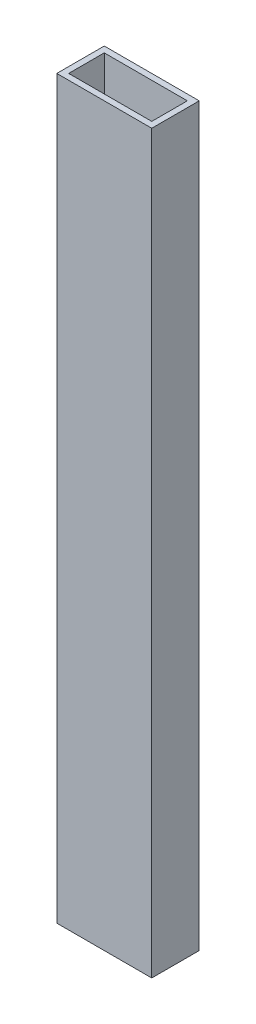
ISO-10303-21;
HEADER;
FILE_DESCRIPTION(('STEP AP214'),'2;1');
FILE_NAME('part.step','',(''),(''),'','','');
FILE_SCHEMA(('AUTOMOTIVE_DESIGN { 1 0 10303 214 1 1 1 1 }'));
ENDSEC;
DATA;
#1=APPLICATION_CONTEXT('core data for automotive mechanical design processes');
#2=APPLICATION_PROTOCOL_DEFINITION('international standard','automotive_design',2000,#1);
#3=PRODUCT_CONTEXT('',#1,'mechanical');
#4=PRODUCT('Part','Part','',(#3));
#5=PRODUCT_RELATED_PRODUCT_CATEGORY('part','',(#4));
#6=PRODUCT_DEFINITION_FORMATION('','',#4);
#7=PRODUCT_DEFINITION_CONTEXT('part definition',#1,'design');
#8=PRODUCT_DEFINITION('design','',#6,#7);
#9=PRODUCT_DEFINITION_SHAPE('','',#8);
#10=(LENGTH_UNIT() NAMED_UNIT(*) SI_UNIT(.MILLI.,.METRE.));
#11=(NAMED_UNIT(*) PLANE_ANGLE_UNIT() SI_UNIT($,.RADIAN.));
#12=(NAMED_UNIT(*) SI_UNIT($,.STERADIAN.) SOLID_ANGLE_UNIT());
#13=UNCERTAINTY_MEASURE_WITH_UNIT(LENGTH_MEASURE(1.E-05),#10,'distance_accuracy_value','');
#14=(GEOMETRIC_REPRESENTATION_CONTEXT(3) GLOBAL_UNCERTAINTY_ASSIGNED_CONTEXT((#13)) GLOBAL_UNIT_ASSIGNED_CONTEXT((#10,
#11,#12)) REPRESENTATION_CONTEXT('',''));
#15=CARTESIAN_POINT('',(0.,0.,0.));
#16=DIRECTION('',(0.,0.,1.));
#17=DIRECTION('',(1.,0.,0.));
#18=AXIS2_PLACEMENT_3D('',#15,#16,#17);
#19=CARTESIAN_POINT('',(0.,196.85,0.));
#20=DIRECTION('',(0.,1.,0.));
#21=DIRECTION('',(0.,0.,1.));
#22=AXIS2_PLACEMENT_3D('',#19,#20,#21);
#23=PLANE('',#22);
#24=DIRECTION('',(0.,0.,-1.));
#25=VECTOR('',#24,1.);
#26=CARTESIAN_POINT('',(25.4,196.85,-12.7));
#27=LINE('',#26,#25);
#28=CARTESIAN_POINT('',(25.4,196.85,12.7));
#29=VERTEX_POINT('',#28);
#30=CARTESIAN_POINT('',(25.4,196.85,-12.7));
#31=VERTEX_POINT('',#30);
#32=EDGE_CURVE('E135',#29,#31,#27,.T.);
#33=ORIENTED_EDGE('',*,*,#32,.T.);
#34=DIRECTION('',(-1.,0.,0.));
#35=VECTOR('',#34,1.);
#36=CARTESIAN_POINT('',(-25.4,196.85,-12.7));
#37=LINE('',#36,#35);
#38=CARTESIAN_POINT('',(-25.4,196.85,-12.7));
#39=VERTEX_POINT('',#38);
#40=EDGE_CURVE('E138',#31,#39,#37,.T.);
#41=ORIENTED_EDGE('',*,*,#40,.T.);
#42=DIRECTION('',(0.,0.,1.));
#43=VECTOR('',#42,1.);
#44=CARTESIAN_POINT('',(-25.4,196.85,-12.7));
#45=LINE('',#44,#43);
#46=CARTESIAN_POINT('',(-25.4,196.85,12.7));
#47=VERTEX_POINT('',#46);
#48=EDGE_CURVE('E141',#39,#47,#45,.T.);
#49=ORIENTED_EDGE('',*,*,#48,.T.);
#50=DIRECTION('',(1.,0.,0.));
#51=VECTOR('',#50,1.);
#52=CARTESIAN_POINT('',(-25.4,196.85,12.7));
#53=LINE('',#52,#51);
#54=EDGE_CURVE('E143',#47,#29,#53,.T.);
#55=ORIENTED_EDGE('',*,*,#54,.T.);
#56=EDGE_LOOP('',(#33,#41,#49,#55));
#57=FACE_BOUND('',#56,.T.);
#58=DIRECTION('',(-1.,0.,0.));
#59=VECTOR('',#58,1.);
#60=CARTESIAN_POINT('',(-22.225,196.85,-9.525));
#61=LINE('',#60,#59);
#62=CARTESIAN_POINT('',(22.225,196.85,-9.525));
#63=VERTEX_POINT('',#62);
#64=CARTESIAN_POINT('',(-22.225,196.85,-9.525));
#65=VERTEX_POINT('',#64);
#66=EDGE_CURVE('E107',#63,#65,#61,.T.);
#67=ORIENTED_EDGE('',*,*,#66,.F.);
#68=DIRECTION('',(0.,0.,-1.));
#69=VECTOR('',#68,1.);
#70=CARTESIAN_POINT('',(22.225,196.85,-9.525));
#71=LINE('',#70,#69);
#72=CARTESIAN_POINT('',(22.225,196.85,9.525));
#73=VERTEX_POINT('',#72);
#74=EDGE_CURVE('E99',#73,#63,#71,.T.);
#75=ORIENTED_EDGE('',*,*,#74,.F.);
#76=DIRECTION('',(1.,0.,0.));
#77=VECTOR('',#76,1.);
#78=CARTESIAN_POINT('',(-22.225,196.85,9.525));
#79=LINE('',#78,#77);
#80=CARTESIAN_POINT('',(-22.225,196.85,9.525));
#81=VERTEX_POINT('',#80);
#82=EDGE_CURVE('E121',#81,#73,#79,.T.);
#83=ORIENTED_EDGE('',*,*,#82,.F.);
#84=DIRECTION('',(0.,0.,1.));
#85=VECTOR('',#84,1.);
#86=CARTESIAN_POINT('',(-22.225,196.85,-9.525));
#87=LINE('',#86,#85);
#88=EDGE_CURVE('E119',#65,#81,#87,.T.);
#89=ORIENTED_EDGE('',*,*,#88,.F.);
#90=EDGE_LOOP('',(#67,#75,#83,#89));
#91=FACE_BOUND('',#90,.T.);
#92=ADVANCED_FACE('F34',(#57,#91),#23,.T.);
#93=CARTESIAN_POINT('',(0.,-196.85,0.));
#94=DIRECTION('',(0.,1.,0.));
#95=DIRECTION('',(0.,0.,1.));
#96=AXIS2_PLACEMENT_3D('',#93,#94,#95);
#97=PLANE('',#96);
#98=DIRECTION('',(0.,0.,-1.));
#99=VECTOR('',#98,1.);
#100=CARTESIAN_POINT('',(25.4,-196.85,-12.7));
#101=LINE('',#100,#99);
#102=CARTESIAN_POINT('',(25.4,-196.85,12.7));
#103=VERTEX_POINT('',#102);
#104=CARTESIAN_POINT('',(25.4,-196.85,-12.7));
#105=VERTEX_POINT('',#104);
#106=EDGE_CURVE('E115',#103,#105,#101,.T.);
#107=ORIENTED_EDGE('',*,*,#106,.F.);
#108=DIRECTION('',(1.,0.,0.));
#109=VECTOR('',#108,1.);
#110=CARTESIAN_POINT('',(-25.4,-196.85,12.7));
#111=LINE('',#110,#109);
#112=CARTESIAN_POINT('',(-25.4,-196.85,12.7));
#113=VERTEX_POINT('',#112);
#114=EDGE_CURVE('E139',#113,#103,#111,.T.);
#115=ORIENTED_EDGE('',*,*,#114,.F.);
#116=DIRECTION('',(0.,0.,1.));
#117=VECTOR('',#116,1.);
#118=CARTESIAN_POINT('',(-25.4,-196.85,-12.7));
#119=LINE('',#118,#117);
#120=CARTESIAN_POINT('',(-25.4,-196.85,-12.7));
#121=VERTEX_POINT('',#120);
#122=EDGE_CURVE('E150',#121,#113,#119,.T.);
#123=ORIENTED_EDGE('',*,*,#122,.F.);
#124=DIRECTION('',(-1.,0.,0.));
#125=VECTOR('',#124,1.);
#126=CARTESIAN_POINT('',(-25.4,-196.85,-12.7));
#127=LINE('',#126,#125);
#128=EDGE_CURVE('E148',#105,#121,#127,.T.);
#129=ORIENTED_EDGE('',*,*,#128,.F.);
#130=EDGE_LOOP('',(#107,#115,#123,#129));
#131=FACE_BOUND('',#130,.T.);
#132=DIRECTION('',(0.,0.,-1.));
#133=VECTOR('',#132,1.);
#134=CARTESIAN_POINT('',(22.225,-196.85,-9.525));
#135=LINE('',#134,#133);
#136=CARTESIAN_POINT('',(22.225,-196.85,9.525));
#137=VERTEX_POINT('',#136);
#138=CARTESIAN_POINT('',(22.225,-196.85,-9.525));
#139=VERTEX_POINT('',#138);
#140=EDGE_CURVE('E57',#137,#139,#135,.T.);
#141=ORIENTED_EDGE('',*,*,#140,.T.);
#142=DIRECTION('',(-1.,0.,0.));
#143=VECTOR('',#142,1.);
#144=CARTESIAN_POINT('',(-22.225,-196.85,-9.525));
#145=LINE('',#144,#143);
#146=CARTESIAN_POINT('',(-22.225,-196.85,-9.525));
#147=VERTEX_POINT('',#146);
#148=EDGE_CURVE('E114',#139,#147,#145,.T.);
#149=ORIENTED_EDGE('',*,*,#148,.T.);
#150=DIRECTION('',(0.,0.,1.));
#151=VECTOR('',#150,1.);
#152=CARTESIAN_POINT('',(-22.225,-196.85,-9.525));
#153=LINE('',#152,#151);
#154=CARTESIAN_POINT('',(-22.225,-196.85,9.525));
#155=VERTEX_POINT('',#154);
#156=EDGE_CURVE('E127',#147,#155,#153,.T.);
#157=ORIENTED_EDGE('',*,*,#156,.T.);
#158=DIRECTION('',(1.,0.,0.));
#159=VECTOR('',#158,1.);
#160=CARTESIAN_POINT('',(-22.225,-196.85,9.525));
#161=LINE('',#160,#159);
#162=EDGE_CURVE('E108',#155,#137,#161,.T.);
#163=ORIENTED_EDGE('',*,*,#162,.T.);
#164=EDGE_LOOP('',(#141,#149,#157,#163));
#165=FACE_BOUND('',#164,.T.);
#166=ADVANCED_FACE('F168',(#131,#165),#97,.F.);
#167=CARTESIAN_POINT('',(25.4,196.85,-12.7));
#168=DIRECTION('',(-1.,0.,0.));
#169=DIRECTION('',(0.,0.,1.));
#170=AXIS2_PLACEMENT_3D('',#167,#168,#169);
#171=PLANE('',#170);
#172=ORIENTED_EDGE('',*,*,#106,.T.);
#173=DIRECTION('',(0.,-1.,0.));
#174=VECTOR('',#173,1.);
#175=CARTESIAN_POINT('',(25.4,196.85,-12.7));
#176=LINE('',#175,#174);
#177=EDGE_CURVE('E11',#31,#105,#176,.T.);
#178=ORIENTED_EDGE('',*,*,#177,.F.);
#179=ORIENTED_EDGE('',*,*,#32,.F.);
#180=DIRECTION('',(0.,-1.,0.));
#181=VECTOR('',#180,1.);
#182=CARTESIAN_POINT('',(25.4,196.85,12.7));
#183=LINE('',#182,#181);
#184=EDGE_CURVE('E145',#29,#103,#183,.T.);
#185=ORIENTED_EDGE('',*,*,#184,.T.);
#186=EDGE_LOOP('',(#172,#178,#179,#185));
#187=FACE_BOUND('',#186,.T.);
#188=ADVANCED_FACE('F36',(#187),#171,.F.);
#189=CARTESIAN_POINT('',(-25.4,196.85,-12.7));
#190=DIRECTION('',(0.,0.,1.));
#191=DIRECTION('',(1.,0.,0.));
#192=AXIS2_PLACEMENT_3D('',#189,#190,#191);
#193=PLANE('',#192);
#194=ORIENTED_EDGE('',*,*,#128,.T.);
#195=DIRECTION('',(0.,-1.,0.));
#196=VECTOR('',#195,1.);
#197=CARTESIAN_POINT('',(-25.4,196.85,-12.7));
#198=LINE('',#197,#196);
#199=EDGE_CURVE('E42',#39,#121,#198,.T.);
#200=ORIENTED_EDGE('',*,*,#199,.F.);
#201=ORIENTED_EDGE('',*,*,#40,.F.);
#202=ORIENTED_EDGE('',*,*,#177,.T.);
#203=EDGE_LOOP('',(#194,#200,#201,#202));
#204=FACE_BOUND('',#203,.T.);
#205=ADVANCED_FACE('F178',(#204),#193,.F.);
#206=CARTESIAN_POINT('',(-25.4,196.85,-12.7));
#207=DIRECTION('',(1.,0.,0.));
#208=DIRECTION('',(0.,0.,-1.));
#209=AXIS2_PLACEMENT_3D('',#206,#207,#208);
#210=PLANE('',#209);
#211=ORIENTED_EDGE('',*,*,#122,.T.);
#212=DIRECTION('',(0.,-1.,0.));
#213=VECTOR('',#212,1.);
#214=CARTESIAN_POINT('',(-25.4,196.85,12.7));
#215=LINE('',#214,#213);
#216=EDGE_CURVE('E155',#47,#113,#215,.T.);
#217=ORIENTED_EDGE('',*,*,#216,.F.);
#218=ORIENTED_EDGE('',*,*,#48,.F.);
#219=ORIENTED_EDGE('',*,*,#199,.T.);
#220=EDGE_LOOP('',(#211,#217,#218,#219));
#221=FACE_BOUND('',#220,.T.);
#222=ADVANCED_FACE('F162',(#221),#210,.F.);
#223=CARTESIAN_POINT('',(-25.4,196.85,12.7));
#224=DIRECTION('',(0.,0.,-1.));
#225=DIRECTION('',(-1.,0.,0.));
#226=AXIS2_PLACEMENT_3D('',#223,#224,#225);
#227=PLANE('',#226);
#228=ORIENTED_EDGE('',*,*,#114,.T.);
#229=ORIENTED_EDGE('',*,*,#184,.F.);
#230=ORIENTED_EDGE('',*,*,#54,.F.);
#231=ORIENTED_EDGE('',*,*,#216,.T.);
#232=EDGE_LOOP('',(#228,#229,#230,#231));
#233=FACE_BOUND('',#232,.T.);
#234=ADVANCED_FACE('F172',(#233),#227,.F.);
#235=CARTESIAN_POINT('',(22.225,196.85,-9.525));
#236=DIRECTION('',(-1.,0.,0.));
#237=DIRECTION('',(0.,0.,1.));
#238=AXIS2_PLACEMENT_3D('',#235,#236,#237);
#239=PLANE('',#238);
#240=ORIENTED_EDGE('',*,*,#140,.F.);
#241=DIRECTION('',(0.,-1.,0.));
#242=VECTOR('',#241,1.);
#243=CARTESIAN_POINT('',(22.225,196.85,9.525));
#244=LINE('',#243,#242);
#245=EDGE_CURVE('E103',#73,#137,#244,.T.);
#246=ORIENTED_EDGE('',*,*,#245,.F.);
#247=ORIENTED_EDGE('',*,*,#74,.T.);
#248=DIRECTION('',(0.,-1.,0.));
#249=VECTOR('',#248,1.);
#250=CARTESIAN_POINT('',(22.225,196.85,-9.525));
#251=LINE('',#250,#249);
#252=EDGE_CURVE('E102',#63,#139,#251,.T.);
#253=ORIENTED_EDGE('',*,*,#252,.T.);
#254=EDGE_LOOP('',(#240,#246,#247,#253));
#255=FACE_BOUND('',#254,.T.);
#256=ADVANCED_FACE('F101',(#255),#239,.T.);
#257=CARTESIAN_POINT('',(-22.225,196.85,-9.525));
#258=DIRECTION('',(0.,0.,1.));
#259=DIRECTION('',(1.,0.,0.));
#260=AXIS2_PLACEMENT_3D('',#257,#258,#259);
#261=PLANE('',#260);
#262=ORIENTED_EDGE('',*,*,#148,.F.);
#263=ORIENTED_EDGE('',*,*,#252,.F.);
#264=ORIENTED_EDGE('',*,*,#66,.T.);
#265=DIRECTION('',(0.,-1.,0.));
#266=VECTOR('',#265,1.);
#267=CARTESIAN_POINT('',(-22.225,196.85,-9.525));
#268=LINE('',#267,#266);
#269=EDGE_CURVE('E116',#65,#147,#268,.T.);
#270=ORIENTED_EDGE('',*,*,#269,.T.);
#271=EDGE_LOOP('',(#262,#263,#264,#270));
#272=FACE_BOUND('',#271,.T.);
#273=ADVANCED_FACE('F111',(#272),#261,.T.);
#274=CARTESIAN_POINT('',(-22.225,196.85,-9.525));
#275=DIRECTION('',(1.,0.,0.));
#276=DIRECTION('',(0.,0.,-1.));
#277=AXIS2_PLACEMENT_3D('',#274,#275,#276);
#278=PLANE('',#277);
#279=ORIENTED_EDGE('',*,*,#156,.F.);
#280=ORIENTED_EDGE('',*,*,#269,.F.);
#281=ORIENTED_EDGE('',*,*,#88,.T.);
#282=DIRECTION('',(0.,-1.,0.));
#283=VECTOR('',#282,1.);
#284=CARTESIAN_POINT('',(-22.225,196.85,9.525));
#285=LINE('',#284,#283);
#286=EDGE_CURVE('E49',#81,#155,#285,.T.);
#287=ORIENTED_EDGE('',*,*,#286,.T.);
#288=EDGE_LOOP('',(#279,#280,#281,#287));
#289=FACE_BOUND('',#288,.T.);
#290=ADVANCED_FACE('F201',(#289),#278,.T.);
#291=CARTESIAN_POINT('',(-22.225,196.85,9.525));
#292=DIRECTION('',(0.,0.,-1.));
#293=DIRECTION('',(-1.,0.,0.));
#294=AXIS2_PLACEMENT_3D('',#291,#292,#293);
#295=PLANE('',#294);
#296=ORIENTED_EDGE('',*,*,#162,.F.);
#297=ORIENTED_EDGE('',*,*,#286,.F.);
#298=ORIENTED_EDGE('',*,*,#82,.T.);
#299=ORIENTED_EDGE('',*,*,#245,.T.);
#300=EDGE_LOOP('',(#296,#297,#298,#299));
#301=FACE_BOUND('',#300,.T.);
#302=ADVANCED_FACE('F205',(#301),#295,.T.);
#303=CLOSED_SHELL('',(#92,#166,#188,#205,#222,#234,#256,#273,#290,#302));
#304=MANIFOLD_SOLID_BREP('B2',#303);
#305=ADVANCED_BREP_SHAPE_REPRESENTATION('',(#18,#304),#14);
#306=SHAPE_DEFINITION_REPRESENTATION(#9,#305);
ENDSEC;
END-ISO-10303-21;
